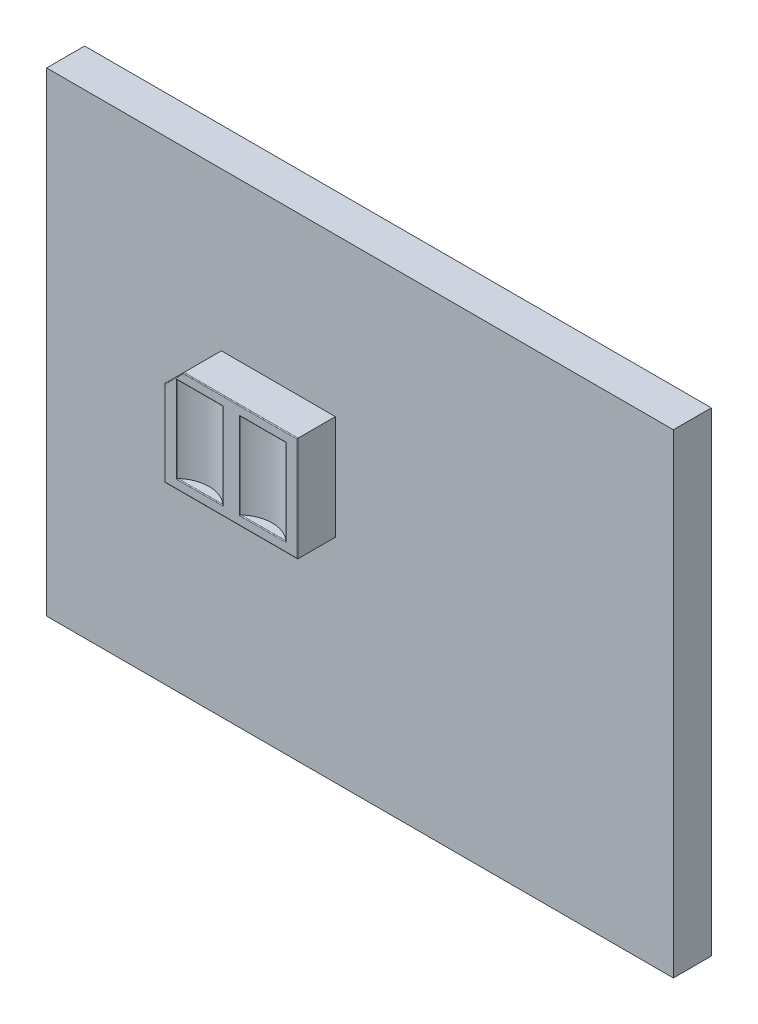
ISO-10303-21;
HEADER;
FILE_DESCRIPTION(('STEP AP214'),'2;1');
FILE_NAME('part.step','',(''),(''),'','','');
FILE_SCHEMA(('AUTOMOTIVE_DESIGN { 1 0 10303 214 1 1 1 1 }'));
ENDSEC;
DATA;
#1=APPLICATION_CONTEXT('core data for automotive mechanical design processes');
#2=APPLICATION_PROTOCOL_DEFINITION('international standard','automotive_design',2000,#1);
#3=PRODUCT_CONTEXT('',#1,'mechanical');
#4=PRODUCT('Part','Part','',(#3));
#5=PRODUCT_RELATED_PRODUCT_CATEGORY('part','',(#4));
#6=PRODUCT_DEFINITION_FORMATION('','',#4);
#7=PRODUCT_DEFINITION_CONTEXT('part definition',#1,'design');
#8=PRODUCT_DEFINITION('design','',#6,#7);
#9=PRODUCT_DEFINITION_SHAPE('','',#8);
#10=(LENGTH_UNIT() NAMED_UNIT(*) SI_UNIT(.MILLI.,.METRE.));
#11=(NAMED_UNIT(*) PLANE_ANGLE_UNIT() SI_UNIT($,.RADIAN.));
#12=(NAMED_UNIT(*) SI_UNIT($,.STERADIAN.) SOLID_ANGLE_UNIT());
#13=UNCERTAINTY_MEASURE_WITH_UNIT(LENGTH_MEASURE(1.E-05),#10,'distance_accuracy_value','');
#14=(GEOMETRIC_REPRESENTATION_CONTEXT(3) GLOBAL_UNCERTAINTY_ASSIGNED_CONTEXT((#13)) GLOBAL_UNIT_ASSIGNED_CONTEXT((#10,
#11,#12)) REPRESENTATION_CONTEXT('',''));
#15=CARTESIAN_POINT('',(0.,0.,0.));
#16=DIRECTION('',(0.,0.,1.));
#17=DIRECTION('',(1.,0.,0.));
#18=AXIS2_PLACEMENT_3D('',#15,#16,#17);
#19=CARTESIAN_POINT('',(-0.65,2.1,2.));
#20=DIRECTION('',(0.,0.,1.));
#21=DIRECTION('',(1.,0.,0.));
#22=AXIS2_PLACEMENT_3D('',#19,#20,#21);
#23=PLANE('',#22);
#24=DIRECTION('',(0.,1.,0.));
#25=VECTOR('',#24,1.);
#26=CARTESIAN_POINT('',(-2.59942700448033,-0.4,2.));
#27=LINE('',#26,#25);
#28=CARTESIAN_POINT('',(-2.59942700448033,1.87,2.));
#29=VERTEX_POINT('',#28);
#30=CARTESIAN_POINT('',(-2.59942700448033,-0.42,2.));
#31=VERTEX_POINT('',#30);
#32=EDGE_CURVE('E281',#29,#31,#27,.F.);
#33=ORIENTED_EDGE('',*,*,#32,.T.);
#34=DIRECTION('',(-1.,0.,0.));
#35=VECTOR('',#34,1.);
#36=CARTESIAN_POINT('',(-3.82761374775193,-0.42,2.));
#37=LINE('',#36,#35);
#38=CARTESIAN_POINT('',(-3.8355895614232,-0.42,2.));
#39=VERTEX_POINT('',#38);
#40=EDGE_CURVE('E283',#31,#39,#37,.T.);
#41=ORIENTED_EDGE('',*,*,#40,.T.);
#42=DIRECTION('',(0.,1.,0.));
#43=VECTOR('',#42,1.);
#44=CARTESIAN_POINT('',(-3.8355895614232,1.85,2.));
#45=LINE('',#44,#43);
#46=CARTESIAN_POINT('',(-3.8355895614232,1.87,2.));
#47=VERTEX_POINT('',#46);
#48=EDGE_CURVE('E277',#39,#47,#45,.T.);
#49=ORIENTED_EDGE('',*,*,#48,.T.);
#50=DIRECTION('',(-1.,0.,0.));
#51=VECTOR('',#50,1.);
#52=CARTESIAN_POINT('',(-0.65,1.87,2.));
#53=LINE('',#52,#51);
#54=EDGE_CURVE('E279',#47,#29,#53,.F.);
#55=ORIENTED_EDGE('',*,*,#54,.T.);
#56=EDGE_LOOP('',(#33,#41,#49,#55));
#57=FACE_BOUND('',#56,.T.);
#58=DIRECTION('',(0.,-1.,0.));
#59=VECTOR('',#58,1.);
#60=CARTESIAN_POINT('',(-4.13,-0.650000000000001,2.));
#61=LINE('',#60,#59);
#62=CARTESIAN_POINT('',(-4.13,1.59171572875254,2.));
#63=VERTEX_POINT('',#62);
#64=CARTESIAN_POINT('',(-4.13,-0.630000000000001,2.));
#65=VERTEX_POINT('',#64);
#66=EDGE_CURVE('E272',#63,#65,#61,.T.);
#67=ORIENTED_EDGE('',*,*,#66,.T.);
#68=DIRECTION('',(1.,0.,0.));
#69=VECTOR('',#68,1.);
#70=CARTESIAN_POINT('',(-0.65,-0.63,2.));
#71=LINE('',#70,#69);
#72=CARTESIAN_POINT('',(-0.67,-0.63,2.));
#73=VERTEX_POINT('',#72);
#74=EDGE_CURVE('E274',#65,#73,#71,.T.);
#75=ORIENTED_EDGE('',*,*,#74,.T.);
#76=DIRECTION('',(0.,1.,0.));
#77=VECTOR('',#76,1.);
#78=CARTESIAN_POINT('',(-0.67,2.1,2.));
#79=LINE('',#78,#77);
#80=CARTESIAN_POINT('',(-0.67,2.08,2.));
#81=VERTEX_POINT('',#80);
#82=EDGE_CURVE('E266',#73,#81,#79,.T.);
#83=ORIENTED_EDGE('',*,*,#82,.T.);
#84=DIRECTION('',(-1.,0.,0.));
#85=VECTOR('',#84,1.);
#86=CARTESIAN_POINT('',(-3.65,2.08,2.));
#87=LINE('',#86,#85);
#88=CARTESIAN_POINT('',(-3.64171572875254,2.08,2.));
#89=VERTEX_POINT('',#88);
#90=EDGE_CURVE('E268',#81,#89,#87,.T.);
#91=ORIENTED_EDGE('',*,*,#90,.T.);
#92=DIRECTION('',(-0.707106781186548,-0.707106781186548,0.));
#93=VECTOR('',#92,1.);
#94=CARTESIAN_POINT('',(-4.13585786437627,1.58585786437627,2.));
#95=LINE('',#94,#93);
#96=EDGE_CURVE('E270',#89,#63,#95,.T.);
#97=ORIENTED_EDGE('',*,*,#96,.T.);
#98=EDGE_LOOP('',(#67,#75,#83,#91,#97));
#99=FACE_BOUND('',#98,.T.);
#100=DIRECTION('',(-1.,0.,0.));
#101=VECTOR('',#100,1.);
#102=CARTESIAN_POINT('',(-0.65,-0.42,2.));
#103=LINE('',#102,#101);
#104=CARTESIAN_POINT('',(-0.940013759684475,-0.42,2.));
#105=VERTEX_POINT('',#104);
#106=CARTESIAN_POINT('',(-2.17617631662735,-0.42,2.));
#107=VERTEX_POINT('',#106);
#108=EDGE_CURVE('E261',#105,#107,#103,.T.);
#109=ORIENTED_EDGE('',*,*,#108,.T.);
#110=DIRECTION('',(0.,1.,0.));
#111=VECTOR('',#110,1.);
#112=CARTESIAN_POINT('',(-2.17617631662735,1.85,2.));
#113=LINE('',#112,#111);
#114=CARTESIAN_POINT('',(-2.17617631662735,1.87,2.));
#115=VERTEX_POINT('',#114);
#116=EDGE_CURVE('E263',#107,#115,#113,.T.);
#117=ORIENTED_EDGE('',*,*,#116,.T.);
#118=DIRECTION('',(-1.,0.,0.));
#119=VECTOR('',#118,1.);
#120=CARTESIAN_POINT('',(-0.947989573355746,1.87,2.));
#121=LINE('',#120,#119);
#122=CARTESIAN_POINT('',(-0.940013759684475,1.87,2.));
#123=VERTEX_POINT('',#122);
#124=EDGE_CURVE('E257',#115,#123,#121,.F.);
#125=ORIENTED_EDGE('',*,*,#124,.T.);
#126=DIRECTION('',(0.,1.,0.));
#127=VECTOR('',#126,1.);
#128=CARTESIAN_POINT('',(-0.940013759684475,-0.4,2.));
#129=LINE('',#128,#127);
#130=EDGE_CURVE('E259',#123,#105,#129,.F.);
#131=ORIENTED_EDGE('',*,*,#130,.T.);
#132=EDGE_LOOP('',(#109,#117,#125,#131));
#133=FACE_BOUND('',#132,.T.);
#134=ADVANCED_FACE('F33',(#57,#99,#133),#23,.T.);
#135=CARTESIAN_POINT('',(-8.25,-6.25,1.));
#136=DIRECTION('',(0.,0.,1.));
#137=DIRECTION('',(1.,0.,0.));
#138=AXIS2_PLACEMENT_3D('',#135,#136,#137);
#139=PLANE('',#138);
#140=DIRECTION('',(0.,-1.,0.));
#141=VECTOR('',#140,1.);
#142=CARTESIAN_POINT('',(-8.25,6.25,1.));
#143=LINE('',#142,#141);
#144=CARTESIAN_POINT('',(-8.25,6.25,1.));
#145=VERTEX_POINT('',#144);
#146=CARTESIAN_POINT('',(-8.25,-6.25,1.));
#147=VERTEX_POINT('',#146);
#148=EDGE_CURVE('E236',#145,#147,#143,.T.);
#149=ORIENTED_EDGE('',*,*,#148,.T.);
#150=DIRECTION('',(1.,0.,0.));
#151=VECTOR('',#150,1.);
#152=CARTESIAN_POINT('',(-8.25,-6.25,1.));
#153=LINE('',#152,#151);
#154=CARTESIAN_POINT('',(8.25,-6.25,1.));
#155=VERTEX_POINT('',#154);
#156=EDGE_CURVE('E239',#147,#155,#153,.T.);
#157=ORIENTED_EDGE('',*,*,#156,.T.);
#158=DIRECTION('',(0.,1.,0.));
#159=VECTOR('',#158,1.);
#160=CARTESIAN_POINT('',(8.25,6.25,1.));
#161=LINE('',#160,#159);
#162=CARTESIAN_POINT('',(8.25,6.25,1.));
#163=VERTEX_POINT('',#162);
#164=EDGE_CURVE('E241',#155,#163,#161,.T.);
#165=ORIENTED_EDGE('',*,*,#164,.T.);
#166=DIRECTION('',(-1.,0.,0.));
#167=VECTOR('',#166,1.);
#168=CARTESIAN_POINT('',(-8.25,6.25,1.));
#169=LINE('',#168,#167);
#170=EDGE_CURVE('E243',#163,#145,#169,.T.);
#171=ORIENTED_EDGE('',*,*,#170,.T.);
#172=EDGE_LOOP('',(#149,#157,#165,#171));
#173=FACE_BOUND('',#172,.T.);
#174=DIRECTION('',(1.,0.,0.));
#175=VECTOR('',#174,1.);
#176=CARTESIAN_POINT('',(-8.25,2.1,1.));
#177=LINE('',#176,#175);
#178=CARTESIAN_POINT('',(-3.65,2.1,1.));
#179=VERTEX_POINT('',#178);
#180=CARTESIAN_POINT('',(-0.65,2.1,1.));
#181=VERTEX_POINT('',#180);
#182=EDGE_CURVE('E221',#179,#181,#177,.T.);
#183=ORIENTED_EDGE('',*,*,#182,.T.);
#184=DIRECTION('',(0.,-1.,0.));
#185=VECTOR('',#184,1.);
#186=CARTESIAN_POINT('',(-0.65,-6.25,1.));
#187=LINE('',#186,#185);
#188=CARTESIAN_POINT('',(-0.65,-0.65,1.));
#189=VERTEX_POINT('',#188);
#190=EDGE_CURVE('E198',#181,#189,#187,.T.);
#191=ORIENTED_EDGE('',*,*,#190,.T.);
#192=DIRECTION('',(-1.,0.,0.));
#193=VECTOR('',#192,1.);
#194=CARTESIAN_POINT('',(-8.25,-0.650000000000001,1.));
#195=LINE('',#194,#193);
#196=CARTESIAN_POINT('',(-4.15,-0.650000000000001,1.));
#197=VERTEX_POINT('',#196);
#198=EDGE_CURVE('E209',#189,#197,#195,.T.);
#199=ORIENTED_EDGE('',*,*,#198,.T.);
#200=DIRECTION('',(0.,1.,0.));
#201=VECTOR('',#200,1.);
#202=CARTESIAN_POINT('',(-4.15,-6.25,1.));
#203=LINE('',#202,#201);
#204=CARTESIAN_POINT('',(-4.15,1.6,1.));
#205=VERTEX_POINT('',#204);
#206=EDGE_CURVE('E215',#197,#205,#203,.T.);
#207=ORIENTED_EDGE('',*,*,#206,.T.);
#208=DIRECTION('',(0.707106781186548,0.707106781186548,0.));
#209=VECTOR('',#208,1.);
#210=CARTESIAN_POINT('',(-10.125,-4.375,1.));
#211=LINE('',#210,#209);
#212=EDGE_CURVE('E227',#205,#179,#211,.T.);
#213=ORIENTED_EDGE('',*,*,#212,.T.);
#214=EDGE_LOOP('',(#183,#191,#199,#207,#213));
#215=FACE_BOUND('',#214,.T.);
#216=ADVANCED_FACE('F218',(#173,#215),#139,.T.);
#217=CARTESIAN_POINT('',(-8.25,6.25,1.));
#218=DIRECTION('',(1.,0.,0.));
#219=DIRECTION('',(0.,0.,-1.));
#220=AXIS2_PLACEMENT_3D('',#217,#218,#219);
#221=PLANE('',#220);
#222=DIRECTION('',(0.,-1.,0.));
#223=VECTOR('',#222,1.);
#224=CARTESIAN_POINT('',(-8.25,6.25,0.));
#225=LINE('',#224,#223);
#226=CARTESIAN_POINT('',(-8.25,6.25,0.));
#227=VERTEX_POINT('',#226);
#228=CARTESIAN_POINT('',(-8.25,-6.25,0.));
#229=VERTEX_POINT('',#228);
#230=EDGE_CURVE('E222',#227,#229,#225,.T.);
#231=ORIENTED_EDGE('',*,*,#230,.T.);
#232=DIRECTION('',(0.,0.,-1.));
#233=VECTOR('',#232,1.);
#234=CARTESIAN_POINT('',(-8.25,-6.25,1.));
#235=LINE('',#234,#233);
#236=EDGE_CURVE('E254',#147,#229,#235,.T.);
#237=ORIENTED_EDGE('',*,*,#236,.F.);
#238=ORIENTED_EDGE('',*,*,#148,.F.);
#239=DIRECTION('',(0.,0.,-1.));
#240=VECTOR('',#239,1.);
#241=CARTESIAN_POINT('',(-8.25,6.25,1.));
#242=LINE('',#241,#240);
#243=EDGE_CURVE('E245',#145,#227,#242,.T.);
#244=ORIENTED_EDGE('',*,*,#243,.T.);
#245=EDGE_LOOP('',(#231,#237,#238,#244));
#246=FACE_BOUND('',#245,.T.);
#247=ADVANCED_FACE('F35',(#246),#221,.F.);
#248=CARTESIAN_POINT('',(-8.25,-6.25,1.));
#249=DIRECTION('',(0.,1.,0.));
#250=DIRECTION('',(0.,0.,1.));
#251=AXIS2_PLACEMENT_3D('',#248,#249,#250);
#252=PLANE('',#251);
#253=DIRECTION('',(1.,0.,0.));
#254=VECTOR('',#253,1.);
#255=CARTESIAN_POINT('',(-8.25,-6.25,0.));
#256=LINE('',#255,#254);
#257=CARTESIAN_POINT('',(8.25,-6.25,0.));
#258=VERTEX_POINT('',#257);
#259=EDGE_CURVE('E225',#229,#258,#256,.T.);
#260=ORIENTED_EDGE('',*,*,#259,.T.);
#261=DIRECTION('',(0.,0.,-1.));
#262=VECTOR('',#261,1.);
#263=CARTESIAN_POINT('',(8.25,-6.25,1.));
#264=LINE('',#263,#262);
#265=EDGE_CURVE('E251',#155,#258,#264,.T.);
#266=ORIENTED_EDGE('',*,*,#265,.F.);
#267=ORIENTED_EDGE('',*,*,#156,.F.);
#268=ORIENTED_EDGE('',*,*,#236,.T.);
#269=EDGE_LOOP('',(#260,#266,#267,#268));
#270=FACE_BOUND('',#269,.T.);
#271=ADVANCED_FACE('F665',(#270),#252,.F.);
#272=CARTESIAN_POINT('',(8.25,6.25,1.));
#273=DIRECTION('',(-1.,0.,0.));
#274=DIRECTION('',(0.,0.,1.));
#275=AXIS2_PLACEMENT_3D('',#272,#273,#274);
#276=PLANE('',#275);
#277=DIRECTION('',(0.,1.,0.));
#278=VECTOR('',#277,1.);
#279=CARTESIAN_POINT('',(8.25,6.25,0.));
#280=LINE('',#279,#278);
#281=CARTESIAN_POINT('',(8.25,6.25,0.));
#282=VERTEX_POINT('',#281);
#283=EDGE_CURVE('E232',#258,#282,#280,.T.);
#284=ORIENTED_EDGE('',*,*,#283,.T.);
#285=DIRECTION('',(0.,0.,-1.));
#286=VECTOR('',#285,1.);
#287=CARTESIAN_POINT('',(8.25,6.25,1.));
#288=LINE('',#287,#286);
#289=EDGE_CURVE('E248',#163,#282,#288,.T.);
#290=ORIENTED_EDGE('',*,*,#289,.F.);
#291=ORIENTED_EDGE('',*,*,#164,.F.);
#292=ORIENTED_EDGE('',*,*,#265,.T.);
#293=EDGE_LOOP('',(#284,#290,#291,#292));
#294=FACE_BOUND('',#293,.T.);
#295=ADVANCED_FACE('F655',(#294),#276,.F.);
#296=CARTESIAN_POINT('',(-8.25,6.25,1.));
#297=DIRECTION('',(0.,-1.,0.));
#298=DIRECTION('',(0.,0.,-1.));
#299=AXIS2_PLACEMENT_3D('',#296,#297,#298);
#300=PLANE('',#299);
#301=DIRECTION('',(-1.,0.,0.));
#302=VECTOR('',#301,1.);
#303=CARTESIAN_POINT('',(-8.25,6.25,0.));
#304=LINE('',#303,#302);
#305=EDGE_CURVE('E234',#282,#227,#304,.T.);
#306=ORIENTED_EDGE('',*,*,#305,.T.);
#307=ORIENTED_EDGE('',*,*,#243,.F.);
#308=ORIENTED_EDGE('',*,*,#170,.F.);
#309=ORIENTED_EDGE('',*,*,#289,.T.);
#310=EDGE_LOOP('',(#306,#307,#308,#309));
#311=FACE_BOUND('',#310,.T.);
#312=ADVANCED_FACE('F637',(#311),#300,.F.);
#313=CARTESIAN_POINT('',(-8.25,-6.25,0.));
#314=DIRECTION('',(0.,0.,1.));
#315=DIRECTION('',(1.,0.,0.));
#316=AXIS2_PLACEMENT_3D('',#313,#314,#315);
#317=PLANE('',#316);
#318=ORIENTED_EDGE('',*,*,#230,.F.);
#319=ORIENTED_EDGE('',*,*,#305,.F.);
#320=ORIENTED_EDGE('',*,*,#283,.F.);
#321=ORIENTED_EDGE('',*,*,#259,.F.);
#322=EDGE_LOOP('',(#318,#319,#320,#321));
#323=FACE_BOUND('',#322,.T.);
#324=ADVANCED_FACE('F621',(#323),#317,.F.);
#325=CARTESIAN_POINT('',(-0.65,2.1,2.));
#326=DIRECTION('',(-1.,0.,0.));
#327=DIRECTION('',(0.,0.,1.));
#328=AXIS2_PLACEMENT_3D('',#325,#326,#327);
#329=PLANE('',#328);
#330=DIRECTION('',(0.,0.,-1.));
#331=VECTOR('',#330,1.);
#332=CARTESIAN_POINT('',(-0.65,2.1,2.));
#333=LINE('',#332,#331);
#334=CARTESIAN_POINT('',(-0.65,2.1,1.98));
#335=VERTEX_POINT('',#334);
#336=EDGE_CURVE('E216',#335,#181,#333,.T.);
#337=ORIENTED_EDGE('',*,*,#336,.F.);
#338=DIRECTION('',(0.,1.,0.));
#339=VECTOR('',#338,1.);
#340=CARTESIAN_POINT('',(-0.65,-0.65,1.98));
#341=LINE('',#340,#339);
#342=CARTESIAN_POINT('',(-0.65,-0.65,1.98));
#343=VERTEX_POINT('',#342);
#344=EDGE_CURVE('E201',#335,#343,#341,.F.);
#345=ORIENTED_EDGE('',*,*,#344,.T.);
#346=DIRECTION('',(0.,0.,-1.));
#347=VECTOR('',#346,1.);
#348=CARTESIAN_POINT('',(-0.65,-0.65,2.));
#349=LINE('',#348,#347);
#350=EDGE_CURVE('E193',#343,#189,#349,.T.);
#351=ORIENTED_EDGE('',*,*,#350,.T.);
#352=ORIENTED_EDGE('',*,*,#190,.F.);
#353=EDGE_LOOP('',(#337,#345,#351,#352));
#354=FACE_BOUND('',#353,.T.);
#355=ADVANCED_FACE('F196',(#354),#329,.F.);
#356=CARTESIAN_POINT('',(-3.65,2.1,2.));
#357=DIRECTION('',(0.,-1.,0.));
#358=DIRECTION('',(0.,0.,-1.));
#359=AXIS2_PLACEMENT_3D('',#356,#357,#358);
#360=PLANE('',#359);
#361=DIRECTION('',(0.,0.,-1.));
#362=VECTOR('',#361,1.);
#363=CARTESIAN_POINT('',(-3.65,2.1,2.));
#364=LINE('',#363,#362);
#365=CARTESIAN_POINT('',(-3.65,2.1,1.98));
#366=VERTEX_POINT('',#365);
#367=EDGE_CURVE('E452',#366,#179,#364,.T.);
#368=ORIENTED_EDGE('',*,*,#367,.F.);
#369=DIRECTION('',(-1.,0.,0.));
#370=VECTOR('',#369,1.);
#371=CARTESIAN_POINT('',(-0.65,2.1,1.98));
#372=LINE('',#371,#370);
#373=EDGE_CURVE('E301',#366,#335,#372,.F.);
#374=ORIENTED_EDGE('',*,*,#373,.T.);
#375=ORIENTED_EDGE('',*,*,#336,.T.);
#376=ORIENTED_EDGE('',*,*,#182,.F.);
#377=EDGE_LOOP('',(#368,#374,#375,#376));
#378=FACE_BOUND('',#377,.T.);
#379=ADVANCED_FACE('F463',(#378),#360,.F.);
#380=CARTESIAN_POINT('',(-4.15,1.6,2.));
#381=DIRECTION('',(0.707106781186547,-0.707106781186547,0.));
#382=DIRECTION('',(0.707106781186548,0.707106781186548,0.));
#383=AXIS2_PLACEMENT_3D('',#380,#381,#382);
#384=PLANE('',#383);
#385=DIRECTION('',(0.,0.,-1.));
#386=VECTOR('',#385,1.);
#387=CARTESIAN_POINT('',(-4.15,1.6,2.));
#388=LINE('',#387,#386);
#389=CARTESIAN_POINT('',(-4.15,1.6,1.98));
#390=VERTEX_POINT('',#389);
#391=EDGE_CURVE('E450',#390,#205,#388,.T.);
#392=ORIENTED_EDGE('',*,*,#391,.F.);
#393=DIRECTION('',(-0.707106781186548,-0.707106781186548,0.));
#394=VECTOR('',#393,1.);
#395=CARTESIAN_POINT('',(-3.65,2.1,1.98));
#396=LINE('',#395,#394);
#397=EDGE_CURVE('E299',#390,#366,#396,.F.);
#398=ORIENTED_EDGE('',*,*,#397,.T.);
#399=ORIENTED_EDGE('',*,*,#367,.T.);
#400=ORIENTED_EDGE('',*,*,#212,.F.);
#401=EDGE_LOOP('',(#392,#398,#399,#400));
#402=FACE_BOUND('',#401,.T.);
#403=ADVANCED_FACE('F458',(#402),#384,.F.);
#404=CARTESIAN_POINT('',(-4.15,-0.650000000000001,2.));
#405=DIRECTION('',(1.,0.,0.));
#406=DIRECTION('',(0.,0.,-1.));
#407=AXIS2_PLACEMENT_3D('',#404,#405,#406);
#408=PLANE('',#407);
#409=DIRECTION('',(0.,0.,-1.));
#410=VECTOR('',#409,1.);
#411=CARTESIAN_POINT('',(-4.15,-0.650000000000001,2.));
#412=LINE('',#411,#410);
#413=CARTESIAN_POINT('',(-4.15,-0.650000000000001,1.98));
#414=VERTEX_POINT('',#413);
#415=EDGE_CURVE('E205',#414,#197,#412,.T.);
#416=ORIENTED_EDGE('',*,*,#415,.F.);
#417=DIRECTION('',(0.,-1.,0.));
#418=VECTOR('',#417,1.);
#419=CARTESIAN_POINT('',(-4.15,1.6,1.98));
#420=LINE('',#419,#418);
#421=EDGE_CURVE('E297',#414,#390,#420,.F.);
#422=ORIENTED_EDGE('',*,*,#421,.T.);
#423=ORIENTED_EDGE('',*,*,#391,.T.);
#424=ORIENTED_EDGE('',*,*,#206,.F.);
#425=EDGE_LOOP('',(#416,#422,#423,#424));
#426=FACE_BOUND('',#425,.T.);
#427=ADVANCED_FACE('F479',(#426),#408,.F.);
#428=CARTESIAN_POINT('',(-0.65,-0.65,2.));
#429=DIRECTION('',(0.,1.,0.));
#430=DIRECTION('',(-1.,0.,0.));
#431=AXIS2_PLACEMENT_3D('',#428,#429,#430);
#432=PLANE('',#431);
#433=ORIENTED_EDGE('',*,*,#350,.F.);
#434=DIRECTION('',(1.,0.,0.));
#435=VECTOR('',#434,1.);
#436=CARTESIAN_POINT('',(-4.15,-0.650000000000001,1.98));
#437=LINE('',#436,#435);
#438=EDGE_CURVE('E295',#343,#414,#437,.F.);
#439=ORIENTED_EDGE('',*,*,#438,.T.);
#440=ORIENTED_EDGE('',*,*,#415,.T.);
#441=ORIENTED_EDGE('',*,*,#198,.F.);
#442=EDGE_LOOP('',(#433,#439,#440,#441));
#443=FACE_BOUND('',#442,.T.);
#444=ADVANCED_FACE('F210',(#443),#432,.F.);
#445=CARTESIAN_POINT('',(-3.21750828295176,1.85,2.63752959298475));
#446=DIRECTION('',(0.,-1.,0.));
#447=DIRECTION('',(0.,0.,-1.));
#448=AXIS2_PLACEMENT_3D('',#445,#446,#447);
#449=CYLINDRICAL_SURFACE('',#448,0.882424308431226);
#450=CARTESIAN_POINT('',(-2.62901232335677,-0.4,1.98));
#451=CARTESIAN_POINT('',(-2.6272001316614,-0.400004634660675,1.981621199439));
#452=CARTESIAN_POINT('',(-2.62538571149282,-0.400198276106645,1.98325934375462));
#453=CARTESIAN_POINT('',(-2.62187863735291,-0.40099829366427,1.98645110285122));
#454=CARTESIAN_POINT('',(-2.62018395909179,-0.40159196531506,1.98800577418616));
#455=CARTESIAN_POINT('',(-2.61759664214169,-0.402885588597754,1.99039714079998));
#456=CARTESIAN_POINT('',(-2.61666159627895,-0.403440608762065,1.99126539401272));
#457=CARTESIAN_POINT('',(-2.6148428174497,-0.404730489495306,1.99296106021631));
#458=CARTESIAN_POINT('',(-2.61396033838843,-0.405468458520367,1.99378743358305));
#459=CARTESIAN_POINT('',(-2.61312524542647,-0.406301759053861,1.9945725150534));
#460=B_SPLINE_CURVE_WITH_KNOTS('',3,(#450,#451,#452,#453,#454,#455,#456,#457,#458,#459),
.UNSPECIFIED.,.F.,.F.,(4,2,2,2,4),(0.,0.00730858401600523,0.0143953594583399,0.0185579599262181,
0.0227968207252711),.UNSPECIFIED.);
#461=CARTESIAN_POINT('',(-2.62901232335677,-0.4,1.98));
#462=VERTEX_POINT('',#461);
#463=CARTESIAN_POINT('',(-2.61312524537869,-0.406301758875194,1.99457251509831));
#464=VERTEX_POINT('',#463);
#465=EDGE_CURVE('E318',#462,#464,#460,.T.);
#466=ORIENTED_EDGE('',*,*,#465,.T.);
#467=DIRECTION('',(0.,-1.,0.));
#468=VECTOR('',#467,1.);
#469=CARTESIAN_POINT('',(-2.61312524537869,1.85,1.99457251509831));
#470=LINE('',#469,#468);
#471=CARTESIAN_POINT('',(-2.61312524537869,1.85630175887519,1.99457251509831));
#472=VERTEX_POINT('',#471);
#473=EDGE_CURVE('E291',#464,#472,#470,.F.);
#474=ORIENTED_EDGE('',*,*,#473,.T.);
#475=CARTESIAN_POINT('',(-2.61312524537869,1.85630175887519,1.99457251509831));
#476=CARTESIAN_POINT('',(-2.61414134057494,1.85528984686767,1.99361714979618));
#477=CARTESIAN_POINT('',(-2.61522530800247,1.85441776198288,1.99260297294066));
#478=CARTESIAN_POINT('',(-2.61746513538666,1.85294195625868,1.99051869911703));
#479=CARTESIAN_POINT('',(-2.61861900017123,1.85233296977245,1.98945022993181));
#480=CARTESIAN_POINT('',(-2.62125844312157,1.85121416392089,1.98702000571836));
#481=CARTESIAN_POINT('',(-2.62275825517914,1.85076127383068,1.98564833132565));
#482=CARTESIAN_POINT('',(-2.62584154788424,1.85015153704388,1.98284822149197));
#483=CARTESIAN_POINT('',(-2.62742619272369,1.8500028705072,1.98141924599033));
#484=CARTESIAN_POINT('',(-2.62901232335594,1.84999999999728,1.98000000000036));
#485=B_SPLINE_CURVE_WITH_KNOTS('',3,(#475,#476,#477,#478,#479,#480,#481,#482,#483,#484),
.UNSPECIFIED.,.F.,.F.,(4,2,2,2,4),(0.,0.00514761137983454,0.0101867987244266,0.0164101130178888,
0.0227986750572116),.UNSPECIFIED.);
#486=CARTESIAN_POINT('',(-2.62901232335677,1.85,1.98));
#487=VERTEX_POINT('',#486);
#488=EDGE_CURVE('E357',#472,#487,#485,.T.);
#489=ORIENTED_EDGE('',*,*,#488,.T.);
#490=CARTESIAN_POINT('',(-3.21750828295176,1.85,2.63752959298475));
#491=DIRECTION('',(0.,-1.,0.));
#492=DIRECTION('',(0.,0.,-1.));
#493=AXIS2_PLACEMENT_3D('',#490,#491,#492);
#494=CIRCLE('',#493,0.882424308431226);
#495=CARTESIAN_POINT('',(-3.80600424254676,1.85,1.98));
#496=VERTEX_POINT('',#495);
#497=EDGE_CURVE('E206',#496,#487,#494,.T.);
#498=ORIENTED_EDGE('',*,*,#497,.F.);
#499=CARTESIAN_POINT('',(-3.80600424254666,1.85,1.97999999999991));
#500=CARTESIAN_POINT('',(-3.80781643424204,1.85000463466067,1.98162119943892));
#501=CARTESIAN_POINT('',(-3.80963085441062,1.85019827610663,1.98325934375454));
#502=CARTESIAN_POINT('',(-3.81313792855054,1.85099829366424,1.98645110285114));
#503=CARTESIAN_POINT('',(-3.81483260681166,1.85159196531503,1.98800577418608));
#504=CARTESIAN_POINT('',(-3.81741992376178,1.85288558859772,1.99039714079993));
#505=CARTESIAN_POINT('',(-3.81835496962453,1.85344060876203,1.99126539401268));
#506=CARTESIAN_POINT('',(-3.8201737484538,1.85473048949529,1.99296106021629));
#507=CARTESIAN_POINT('',(-3.82105622751509,1.85546845852036,1.99378743358304));
#508=CARTESIAN_POINT('',(-3.82189132047706,1.85630175905386,1.9945725150534));
#509=B_SPLINE_CURVE_WITH_KNOTS('',3,(#499,#500,#501,#502,#503,#504,#505,#506,#507,#508),
.UNSPECIFIED.,.F.,.F.,(4,2,2,2,4),(0.,0.00730858401601745,0.0143953594583633,0.0185579599262927,
0.0227968207253995),.UNSPECIFIED.);
#510=CARTESIAN_POINT('',(-3.82189132052484,1.85630175887519,1.99457251509831));
#511=VERTEX_POINT('',#510);
#512=EDGE_CURVE('E352',#496,#511,#509,.T.);
#513=ORIENTED_EDGE('',*,*,#512,.T.);
#514=DIRECTION('',(0.,-1.,0.));
#515=VECTOR('',#514,1.);
#516=CARTESIAN_POINT('',(-3.82189132052484,1.85,1.99457251509831));
#517=LINE('',#516,#515);
#518=CARTESIAN_POINT('',(-3.82189132052484,-0.406301758875194,1.99457251509831));
#519=VERTEX_POINT('',#518);
#520=EDGE_CURVE('E289',#511,#519,#517,.T.);
#521=ORIENTED_EDGE('',*,*,#520,.T.);
#522=CARTESIAN_POINT('',(-3.82189132052484,-0.406301758875194,1.99457251509831));
#523=CARTESIAN_POINT('',(-3.82087522532859,-0.405289846867672,1.99361714979618));
#524=CARTESIAN_POINT('',(-3.81979125790106,-0.404417761982883,1.99260297294066));
#525=CARTESIAN_POINT('',(-3.81755143051686,-0.402941956258676,1.99051869911703));
#526=CARTESIAN_POINT('',(-3.8163975657323,-0.402332969772448,1.98945022993181));
#527=CARTESIAN_POINT('',(-3.81375812278196,-0.401214163920892,1.98702000571836));
#528=CARTESIAN_POINT('',(-3.81225831072439,-0.400761273830685,1.98564833132565));
#529=CARTESIAN_POINT('',(-3.80917501801928,-0.400151537043876,1.98284822149197));
#530=CARTESIAN_POINT('',(-3.80759037317983,-0.4000028705072,1.98141924599032));
#531=CARTESIAN_POINT('',(-3.80600424254758,-0.399999999997281,1.98000000000035));
#532=B_SPLINE_CURVE_WITH_KNOTS('',3,(#522,#523,#524,#525,#526,#527,#528,#529,#530,#531),
.UNSPECIFIED.,.F.,.F.,(4,2,2,2,4),(0.,0.00514761137983448,0.0101867987244265,0.0164101130178927,
0.0227986750572186),.UNSPECIFIED.);
#533=CARTESIAN_POINT('',(-3.80600424254676,-0.4,1.98));
#534=VERTEX_POINT('',#533);
#535=EDGE_CURVE('E311',#519,#534,#532,.T.);
#536=ORIENTED_EDGE('',*,*,#535,.T.);
#537=CARTESIAN_POINT('',(-3.21750828295176,-0.4,2.63752959298475));
#538=DIRECTION('',(0.,-1.,0.));
#539=DIRECTION('',(0.,0.,-1.));
#540=AXIS2_PLACEMENT_3D('',#537,#538,#539);
#541=CIRCLE('',#540,0.882424308431226);
#542=EDGE_CURVE('E444',#534,#462,#541,.T.);
#543=ORIENTED_EDGE('',*,*,#542,.T.);
#544=EDGE_LOOP('',(#466,#474,#489,#498,#513,#521,#536,#543));
#545=FACE_BOUND('',#544,.T.);
#546=ADVANCED_FACE('F323',(#545),#449,.F.);
#547=CARTESIAN_POINT('',(-3.21750828295176,1.85,2.63752959298475));
#548=DIRECTION('',(0.,-1.,0.));
#549=DIRECTION('',(0.,0.,-1.));
#550=AXIS2_PLACEMENT_3D('',#547,#548,#549);
#551=PLANE('',#550);
#552=ORIENTED_EDGE('',*,*,#497,.T.);
#553=DIRECTION('',(-1.,0.,0.));
#554=VECTOR('',#553,1.);
#555=CARTESIAN_POINT('',(-3.21750828295176,1.85,1.98));
#556=LINE('',#555,#554);
#557=EDGE_CURVE('E293',#487,#496,#556,.T.);
#558=ORIENTED_EDGE('',*,*,#557,.T.);
#559=EDGE_LOOP('',(#552,#558));
#560=FACE_BOUND('',#559,.T.);
#561=ADVANCED_FACE('F563',(#560),#551,.T.);
#562=CARTESIAN_POINT('',(-3.21750828295176,-0.4,2.63752959298475));
#563=DIRECTION('',(0.,-1.,0.));
#564=DIRECTION('',(0.,0.,-1.));
#565=AXIS2_PLACEMENT_3D('',#562,#563,#564);
#566=PLANE('',#565);
#567=ORIENTED_EDGE('',*,*,#542,.F.);
#568=DIRECTION('',(-1.,0.,0.));
#569=VECTOR('',#568,1.);
#570=CARTESIAN_POINT('',(-2.6074028181516,-0.4,1.98));
#571=LINE('',#570,#569);
#572=EDGE_CURVE('E286',#534,#462,#571,.F.);
#573=ORIENTED_EDGE('',*,*,#572,.T.);
#574=EDGE_LOOP('',(#567,#573));
#575=FACE_BOUND('',#574,.T.);
#576=ADVANCED_FACE('F505',(#575),#566,.F.);
#577=CARTESIAN_POINT('',(-1.55809503815591,1.85,2.63752959298475));
#578=DIRECTION('',(0.,-1.,0.));
#579=DIRECTION('',(0.,0.,-1.));
#580=AXIS2_PLACEMENT_3D('',#577,#578,#579);
#581=CYLINDRICAL_SURFACE('',#580,0.882424308431226);
#582=CARTESIAN_POINT('',(-1.55809503815591,1.85,2.63752959298475));
#583=DIRECTION('',(0.,-1.,0.));
#584=DIRECTION('',(0.,0.,1.));
#585=AXIS2_PLACEMENT_3D('',#582,#583,#584);
#586=CIRCLE('',#585,0.882424308431226);
#587=CARTESIAN_POINT('',(-2.14659099775091,1.85,1.98));
#588=VERTEX_POINT('',#587);
#589=CARTESIAN_POINT('',(-0.969599078560915,1.85,1.98));
#590=VERTEX_POINT('',#589);
#591=EDGE_CURVE('E441',#588,#590,#586,.T.);
#592=ORIENTED_EDGE('',*,*,#591,.F.);
#593=CARTESIAN_POINT('',(-2.14659099775081,1.85,1.97999999999991));
#594=CARTESIAN_POINT('',(-2.14840318944619,1.85000463466067,1.98162119943892));
#595=CARTESIAN_POINT('',(-2.15021760961477,1.85019827610663,1.98325934375454));
#596=CARTESIAN_POINT('',(-2.15372468375469,1.85099829366424,1.98645110285114));
#597=CARTESIAN_POINT('',(-2.1554193620158,1.85159196531503,1.98800577418609));
#598=CARTESIAN_POINT('',(-2.15800667896593,1.85288558859772,1.99039714079993));
#599=CARTESIAN_POINT('',(-2.15894172482868,1.85344060876203,1.99126539401268));
#600=CARTESIAN_POINT('',(-2.16076050365795,1.85473048949529,1.99296106021629));
#601=CARTESIAN_POINT('',(-2.16164298271923,1.85546845852036,1.99378743358304));
#602=CARTESIAN_POINT('',(-2.16247807568121,1.85630175905386,1.9945725150534));
#603=B_SPLINE_CURVE_WITH_KNOTS('',3,(#593,#594,#595,#596,#597,#598,#599,#600,#601,#602),
.UNSPECIFIED.,.F.,.F.,(4,2,2,2,4),(0.,0.0073085840160175,0.0143953594583634,0.0185579599262915,
0.022796820725398),.UNSPECIFIED.);
#604=CARTESIAN_POINT('',(-2.16247807572899,1.85630175887519,1.99457251509831));
#605=VERTEX_POINT('',#604);
#606=EDGE_CURVE('E46',#588,#605,#603,.T.);
#607=ORIENTED_EDGE('',*,*,#606,.T.);
#608=DIRECTION('',(0.,-1.,0.));
#609=VECTOR('',#608,1.);
#610=CARTESIAN_POINT('',(-2.16247807572899,1.85,1.99457251509831));
#611=LINE('',#610,#609);
#612=CARTESIAN_POINT('',(-2.16247807572899,-0.406301758875193,1.99457251509831));
#613=VERTEX_POINT('',#612);
#614=EDGE_CURVE('E305',#605,#613,#611,.T.);
#615=ORIENTED_EDGE('',*,*,#614,.T.);
#616=CARTESIAN_POINT('',(-2.16247807572899,-0.406301758875193,1.99457251509831));
#617=CARTESIAN_POINT('',(-2.16146198053274,-0.405289846867671,1.99361714979618));
#618=CARTESIAN_POINT('',(-2.16037801310521,-0.404417761982883,1.99260297294066));
#619=CARTESIAN_POINT('',(-2.15813818572101,-0.402941956258676,1.99051869911703));
#620=CARTESIAN_POINT('',(-2.15698432093644,-0.402332969772448,1.98945022993181));
#621=CARTESIAN_POINT('',(-2.15434487798611,-0.401214163920892,1.98702000571836));
#622=CARTESIAN_POINT('',(-2.15284506592854,-0.400761273830685,1.98564833132565));
#623=CARTESIAN_POINT('',(-2.14976177322343,-0.400151537043876,1.98284822149197));
#624=CARTESIAN_POINT('',(-2.14817712838398,-0.4000028705072,1.98141924599032));
#625=CARTESIAN_POINT('',(-2.14659099775173,-0.399999999997281,1.98000000000035));
#626=B_SPLINE_CURVE_WITH_KNOTS('',3,(#616,#617,#618,#619,#620,#621,#622,#623,#624,#625),
.UNSPECIFIED.,.F.,.F.,(4,2,2,2,4),(0.,0.00514761137983409,0.0101867987244264,0.016410113017893,
0.022798675057217),.UNSPECIFIED.);
#627=CARTESIAN_POINT('',(-2.14659099775091,-0.4,1.98));
#628=VERTEX_POINT('',#627);
#629=EDGE_CURVE('E362',#613,#628,#626,.T.);
#630=ORIENTED_EDGE('',*,*,#629,.T.);
#631=CARTESIAN_POINT('',(-1.55809503815591,-0.4,2.63752959298475));
#632=DIRECTION('',(0.,-1.,0.));
#633=DIRECTION('',(0.,0.,1.));
#634=AXIS2_PLACEMENT_3D('',#631,#632,#633);
#635=CIRCLE('',#634,0.882424308431226);
#636=CARTESIAN_POINT('',(-0.969599078560915,-0.4,1.98));
#637=VERTEX_POINT('',#636);
#638=EDGE_CURVE('E401',#628,#637,#635,.T.);
#639=ORIENTED_EDGE('',*,*,#638,.T.);
#640=CARTESIAN_POINT('',(-0.969599078560914,-0.4,1.98));
#641=CARTESIAN_POINT('',(-0.967786886865544,-0.400004634660675,1.981621199439));
#642=CARTESIAN_POINT('',(-0.965972466696964,-0.400198276106645,1.98325934375462));
#643=CARTESIAN_POINT('',(-0.962465392557053,-0.40099829366427,1.98645110285122));
#644=CARTESIAN_POINT('',(-0.960770714295942,-0.40159196531506,1.98800577418616));
#645=CARTESIAN_POINT('',(-0.958183397345835,-0.402885588597755,1.99039714079998));
#646=CARTESIAN_POINT('',(-0.957248351483098,-0.403440608762065,1.99126539401272));
#647=CARTESIAN_POINT('',(-0.95542957265385,-0.404730489495306,1.99296106021631));
#648=CARTESIAN_POINT('',(-0.954547093592578,-0.405468458520367,1.99378743358305));
#649=CARTESIAN_POINT('',(-0.953712000630615,-0.406301759053861,1.9945725150534));
#650=B_SPLINE_CURVE_WITH_KNOTS('',3,(#640,#641,#642,#643,#644,#645,#646,#647,#648,#649),
.UNSPECIFIED.,.F.,.F.,(4,2,2,2,4),(0.,0.00730858401600573,0.0143953594583401,0.0185579599262176,
0.0227968207252712),.UNSPECIFIED.);
#651=CARTESIAN_POINT('',(-0.953712000582837,-0.406301758875194,1.99457251509831));
#652=VERTEX_POINT('',#651);
#653=EDGE_CURVE('E368',#637,#652,#650,.T.);
#654=ORIENTED_EDGE('',*,*,#653,.T.);
#655=DIRECTION('',(0.,-1.,0.));
#656=VECTOR('',#655,1.);
#657=CARTESIAN_POINT('',(-0.953712000582837,1.85,1.99457251509831));
#658=LINE('',#657,#656);
#659=CARTESIAN_POINT('',(-0.953712000582837,1.85630175887519,1.99457251509831));
#660=VERTEX_POINT('',#659);
#661=EDGE_CURVE('E52',#652,#660,#658,.F.);
#662=ORIENTED_EDGE('',*,*,#661,.T.);
#663=CARTESIAN_POINT('',(-0.953712000582837,1.85630175887519,1.99457251509831));
#664=CARTESIAN_POINT('',(-0.954728095779083,1.85528984686767,1.99361714979618));
#665=CARTESIAN_POINT('',(-0.955812063206615,1.85441776198288,1.99260297294066));
#666=CARTESIAN_POINT('',(-0.958051890590812,1.85294195625868,1.99051869911703));
#667=CARTESIAN_POINT('',(-0.959205755375378,1.85233296977245,1.98945022993181));
#668=CARTESIAN_POINT('',(-0.961845198325713,1.85121416392089,1.98702000571836));
#669=CARTESIAN_POINT('',(-0.963345010383286,1.85076127383068,1.98564833132565));
#670=CARTESIAN_POINT('',(-0.966428303088391,1.85015153704388,1.98284822149197));
#671=CARTESIAN_POINT('',(-0.968012947927843,1.8500028705072,1.98141924599033));
#672=CARTESIAN_POINT('',(-0.96959907856009,1.84999999999728,1.98000000000036));
#673=B_SPLINE_CURVE_WITH_KNOTS('',3,(#663,#664,#665,#666,#667,#668,#669,#670,#671,#672),
.UNSPECIFIED.,.F.,.F.,(4,2,2,2,4),(0.,0.0051476113798344,0.0101867987244265,0.0164101130178895,
0.0227986750572123),.UNSPECIFIED.);
#674=EDGE_CURVE('E11',#660,#590,#673,.T.);
#675=ORIENTED_EDGE('',*,*,#674,.T.);
#676=EDGE_LOOP('',(#592,#607,#615,#630,#639,#654,#662,#675));
#677=FACE_BOUND('',#676,.T.);
#678=ADVANCED_FACE('F372',(#677),#581,.F.);
#679=CARTESIAN_POINT('',(-1.55809503815591,1.85,2.63752959298475));
#680=DIRECTION('',(0.,1.,0.));
#681=DIRECTION('',(0.,0.,1.));
#682=AXIS2_PLACEMENT_3D('',#679,#680,#681);
#683=PLANE('',#682);
#684=ORIENTED_EDGE('',*,*,#591,.T.);
#685=DIRECTION('',(-1.,0.,0.));
#686=VECTOR('',#685,1.);
#687=CARTESIAN_POINT('',(-2.16820050295608,1.85,1.98));
#688=LINE('',#687,#686);
#689=EDGE_CURVE('E309',#590,#588,#688,.T.);
#690=ORIENTED_EDGE('',*,*,#689,.T.);
#691=EDGE_LOOP('',(#684,#690));
#692=FACE_BOUND('',#691,.T.);
#693=ADVANCED_FACE('F497',(#692),#683,.F.);
#694=CARTESIAN_POINT('',(-1.55809503815591,-0.4,2.63752959298475));
#695=DIRECTION('',(0.,1.,0.));
#696=DIRECTION('',(0.,0.,1.));
#697=AXIS2_PLACEMENT_3D('',#694,#695,#696);
#698=PLANE('',#697);
#699=ORIENTED_EDGE('',*,*,#638,.F.);
#700=DIRECTION('',(-1.,0.,0.));
#701=VECTOR('',#700,1.);
#702=CARTESIAN_POINT('',(-1.55809503815591,-0.4,1.98));
#703=LINE('',#702,#701);
#704=EDGE_CURVE('E307',#628,#637,#703,.F.);
#705=ORIENTED_EDGE('',*,*,#704,.T.);
#706=EDGE_LOOP('',(#699,#705));
#707=FACE_BOUND('',#706,.T.);
#708=ADVANCED_FACE('F348',(#707),#698,.T.);
#709=CARTESIAN_POINT('',(-3.21750828295176,1.87,1.98));
#710=DIRECTION('',(-1.,0.,0.));
#711=DIRECTION('',(0.,0.,1.));
#712=AXIS2_PLACEMENT_3D('',#709,#710,#711);
#713=CYLINDRICAL_SURFACE('',#712,0.02);
#714=ORIENTED_EDGE('',*,*,#557,.F.);
#715=ORIENTED_EDGE('',*,*,#488,.F.);
#716=CARTESIAN_POINT('',(-2.59942700448033,1.87,1.98));
#717=DIRECTION('',(0.707106781186547,-0.707106781186547,0.));
#718=DIRECTION('',(-0.707106781186547,-0.707106781186547,0.));
#719=AXIS2_PLACEMENT_3D('',#716,#717,#718);
#720=ELLIPSE('',#719,0.0282842712474619,0.02);
#721=EDGE_CURVE('E437',#29,#472,#720,.T.);
#722=ORIENTED_EDGE('',*,*,#721,.F.);
#723=ORIENTED_EDGE('',*,*,#54,.F.);
#724=CARTESIAN_POINT('',(-3.8355895614232,1.87,1.98));
#725=DIRECTION('',(-0.707106781186547,-0.707106781186547,0.));
#726=DIRECTION('',(-0.707106781186547,0.707106781186547,0.));
#727=AXIS2_PLACEMENT_3D('',#724,#725,#726);
#728=ELLIPSE('',#727,0.0282842712474619,0.02);
#729=EDGE_CURVE('E434',#511,#47,#728,.T.);
#730=ORIENTED_EDGE('',*,*,#729,.F.);
#731=ORIENTED_EDGE('',*,*,#512,.F.);
#732=EDGE_LOOP('',(#714,#715,#722,#723,#730,#731));
#733=FACE_BOUND('',#732,.T.);
#734=ADVANCED_FACE('F343',(#733),#713,.T.);
#735=CARTESIAN_POINT('',(-2.59942700448033,1.85,1.98));
#736=DIRECTION('',(0.,-1.,0.));
#737=DIRECTION('',(0.,0.,-1.));
#738=AXIS2_PLACEMENT_3D('',#735,#736,#737);
#739=CYLINDRICAL_SURFACE('',#738,0.02);
#740=ORIENTED_EDGE('',*,*,#473,.F.);
#741=CARTESIAN_POINT('',(-2.59942700448033,-0.42,1.98));
#742=DIRECTION('',(0.707106781186547,0.707106781186547,0.));
#743=DIRECTION('',(0.707106781186547,-0.707106781186547,0.));
#744=AXIS2_PLACEMENT_3D('',#741,#742,#743);
#745=ELLIPSE('',#744,0.0282842712474619,0.02);
#746=EDGE_CURVE('E431',#31,#464,#745,.F.);
#747=ORIENTED_EDGE('',*,*,#746,.F.);
#748=ORIENTED_EDGE('',*,*,#32,.F.);
#749=ORIENTED_EDGE('',*,*,#721,.T.);
#750=EDGE_LOOP('',(#740,#747,#748,#749));
#751=FACE_BOUND('',#750,.T.);
#752=ADVANCED_FACE('F339',(#751),#739,.T.);
#753=CARTESIAN_POINT('',(-3.8355895614232,1.85,1.98));
#754=DIRECTION('',(0.,-1.,0.));
#755=DIRECTION('',(0.,0.,-1.));
#756=AXIS2_PLACEMENT_3D('',#753,#754,#755);
#757=CYLINDRICAL_SURFACE('',#756,0.02);
#758=ORIENTED_EDGE('',*,*,#729,.T.);
#759=ORIENTED_EDGE('',*,*,#48,.F.);
#760=CARTESIAN_POINT('',(-3.8355895614232,-0.42,1.98));
#761=DIRECTION('',(0.707106781186547,-0.707106781186547,0.));
#762=DIRECTION('',(0.707106781186547,0.707106781186547,0.));
#763=AXIS2_PLACEMENT_3D('',#760,#761,#762);
#764=ELLIPSE('',#763,0.0282842712474619,0.02);
#765=EDGE_CURVE('E429',#519,#39,#764,.T.);
#766=ORIENTED_EDGE('',*,*,#765,.F.);
#767=ORIENTED_EDGE('',*,*,#520,.F.);
#768=EDGE_LOOP('',(#758,#759,#766,#767));
#769=FACE_BOUND('',#768,.T.);
#770=ADVANCED_FACE('F333',(#769),#757,.T.);
#771=CARTESIAN_POINT('',(-0.65,-0.42,1.98));
#772=DIRECTION('',(1.,0.,0.));
#773=DIRECTION('',(0.,0.,-1.));
#774=AXIS2_PLACEMENT_3D('',#771,#772,#773);
#775=CYLINDRICAL_SURFACE('',#774,0.02);
#776=ORIENTED_EDGE('',*,*,#465,.F.);
#777=ORIENTED_EDGE('',*,*,#572,.F.);
#778=ORIENTED_EDGE('',*,*,#535,.F.);
#779=ORIENTED_EDGE('',*,*,#765,.T.);
#780=ORIENTED_EDGE('',*,*,#40,.F.);
#781=ORIENTED_EDGE('',*,*,#746,.T.);
#782=EDGE_LOOP('',(#776,#777,#778,#779,#780,#781));
#783=FACE_BOUND('',#782,.T.);
#784=ADVANCED_FACE('F327',(#783),#775,.T.);
#785=CARTESIAN_POINT('',(-2.13585786437627,3.58585786437627,1.98));
#786=DIRECTION('',(0.707106781186548,0.707106781186548,0.));
#787=DIRECTION('',(-0.707106781186548,0.707106781186548,0.));
#788=AXIS2_PLACEMENT_3D('',#785,#786,#787);
#789=CYLINDRICAL_SURFACE('',#788,0.02);
#790=CARTESIAN_POINT('',(-4.13,1.59171572875254,1.98));
#791=DIRECTION('',(0.38268343236509,0.923879532511287,0.));
#792=DIRECTION('',(0.923879532511287,-0.38268343236509,0.));
#793=AXIS2_PLACEMENT_3D('',#790,#791,#792);
#794=ELLIPSE('',#793,0.0216478440058479,0.02);
#795=EDGE_CURVE('E423',#63,#390,#794,.F.);
#796=ORIENTED_EDGE('',*,*,#795,.F.);
#797=ORIENTED_EDGE('',*,*,#96,.F.);
#798=CARTESIAN_POINT('',(-3.64171572875254,2.08,1.98));
#799=DIRECTION('',(0.923879532511287,0.38268343236509,0.));
#800=DIRECTION('',(0.38268343236509,-0.923879532511287,0.));
#801=AXIS2_PLACEMENT_3D('',#798,#799,#800);
#802=ELLIPSE('',#801,0.0216478440058479,0.02);
#803=EDGE_CURVE('E426',#366,#89,#802,.T.);
#804=ORIENTED_EDGE('',*,*,#803,.F.);
#805=ORIENTED_EDGE('',*,*,#397,.F.);
#806=EDGE_LOOP('',(#796,#797,#804,#805));
#807=FACE_BOUND('',#806,.T.);
#808=ADVANCED_FACE('F332',(#807),#789,.T.);
#809=CARTESIAN_POINT('',(-0.65,2.08,1.98));
#810=DIRECTION('',(1.,0.,0.));
#811=DIRECTION('',(0.,0.,-1.));
#812=AXIS2_PLACEMENT_3D('',#809,#810,#811);
#813=CYLINDRICAL_SURFACE('',#812,0.02);
#814=ORIENTED_EDGE('',*,*,#803,.T.);
#815=ORIENTED_EDGE('',*,*,#90,.F.);
#816=CARTESIAN_POINT('',(-0.67,2.08,1.98));
#817=DIRECTION('',(0.707106781186547,-0.707106781186547,0.));
#818=DIRECTION('',(-0.707106781186547,-0.707106781186547,0.));
#819=AXIS2_PLACEMENT_3D('',#816,#817,#818);
#820=ELLIPSE('',#819,0.0282842712474619,0.02);
#821=EDGE_CURVE('E420',#335,#81,#820,.T.);
#822=ORIENTED_EDGE('',*,*,#821,.F.);
#823=ORIENTED_EDGE('',*,*,#373,.F.);
#824=EDGE_LOOP('',(#814,#815,#822,#823));
#825=FACE_BOUND('',#824,.T.);
#826=ADVANCED_FACE('F468',(#825),#813,.T.);
#827=CARTESIAN_POINT('',(-4.13,2.1,1.98));
#828=DIRECTION('',(0.,1.,0.));
#829=DIRECTION('',(0.,0.,1.));
#830=AXIS2_PLACEMENT_3D('',#827,#828,#829);
#831=CYLINDRICAL_SURFACE('',#830,0.02);
#832=ORIENTED_EDGE('',*,*,#795,.T.);
#833=ORIENTED_EDGE('',*,*,#421,.F.);
#834=CARTESIAN_POINT('',(-4.13,-0.630000000000001,1.98));
#835=DIRECTION('',(-0.707106781186548,0.707106781186547,0.));
#836=DIRECTION('',(0.707106781186547,0.707106781186548,0.));
#837=AXIS2_PLACEMENT_3D('',#834,#835,#836);
#838=ELLIPSE('',#837,0.0282842712474619,0.02);
#839=EDGE_CURVE('E418',#65,#414,#838,.F.);
#840=ORIENTED_EDGE('',*,*,#839,.F.);
#841=ORIENTED_EDGE('',*,*,#66,.F.);
#842=EDGE_LOOP('',(#832,#833,#840,#841));
#843=FACE_BOUND('',#842,.T.);
#844=ADVANCED_FACE('F481',(#843),#831,.T.);
#845=CARTESIAN_POINT('',(-0.67,2.1,1.98));
#846=DIRECTION('',(0.,-1.,0.));
#847=DIRECTION('',(0.,0.,-1.));
#848=AXIS2_PLACEMENT_3D('',#845,#846,#847);
#849=CYLINDRICAL_SURFACE('',#848,0.02);
#850=ORIENTED_EDGE('',*,*,#821,.T.);
#851=ORIENTED_EDGE('',*,*,#82,.F.);
#852=CARTESIAN_POINT('',(-0.67,-0.63,1.98));
#853=DIRECTION('',(-0.707106781186547,-0.707106781186548,0.));
#854=DIRECTION('',(0.707106781186548,-0.707106781186547,0.));
#855=AXIS2_PLACEMENT_3D('',#852,#853,#854);
#856=ELLIPSE('',#855,0.0282842712474619,0.02);
#857=EDGE_CURVE('E411',#343,#73,#856,.T.);
#858=ORIENTED_EDGE('',*,*,#857,.F.);
#859=ORIENTED_EDGE('',*,*,#344,.F.);
#860=EDGE_LOOP('',(#850,#851,#858,#859));
#861=FACE_BOUND('',#860,.T.);
#862=ADVANCED_FACE('F472',(#861),#849,.T.);
#863=CARTESIAN_POINT('',(-0.649999999999999,-0.63,1.98));
#864=DIRECTION('',(-1.,0.,0.));
#865=DIRECTION('',(0.,-1.,0.));
#866=AXIS2_PLACEMENT_3D('',#863,#864,#865);
#867=CYLINDRICAL_SURFACE('',#866,0.02);
#868=ORIENTED_EDGE('',*,*,#839,.T.);
#869=ORIENTED_EDGE('',*,*,#438,.F.);
#870=ORIENTED_EDGE('',*,*,#857,.T.);
#871=ORIENTED_EDGE('',*,*,#74,.F.);
#872=EDGE_LOOP('',(#868,#869,#870,#871));
#873=FACE_BOUND('',#872,.T.);
#874=ADVANCED_FACE('F475',(#873),#867,.T.);
#875=CARTESIAN_POINT('',(-0.940013759684475,1.85,1.98));
#876=DIRECTION('',(0.,-1.,0.));
#877=DIRECTION('',(0.,0.,-1.));
#878=AXIS2_PLACEMENT_3D('',#875,#876,#877);
#879=CYLINDRICAL_SURFACE('',#878,0.02);
#880=CARTESIAN_POINT('',(-0.940013759684475,-0.42,1.98));
#881=DIRECTION('',(-0.707106781186547,-0.707106781186547,0.));
#882=DIRECTION('',(-0.707106781186547,0.707106781186547,0.));
#883=AXIS2_PLACEMENT_3D('',#880,#881,#882);
#884=ELLIPSE('',#883,0.0282842712474619,0.02);
#885=EDGE_CURVE('E404',#105,#652,#884,.T.);
#886=ORIENTED_EDGE('',*,*,#885,.F.);
#887=ORIENTED_EDGE('',*,*,#130,.F.);
#888=CARTESIAN_POINT('',(-0.940013759684475,1.87,1.98));
#889=DIRECTION('',(0.707106781186547,-0.707106781186547,0.));
#890=DIRECTION('',(-0.707106781186547,-0.707106781186547,0.));
#891=AXIS2_PLACEMENT_3D('',#888,#889,#890);
#892=ELLIPSE('',#891,0.0282842712474619,0.02);
#893=EDGE_CURVE('E407',#660,#123,#892,.F.);
#894=ORIENTED_EDGE('',*,*,#893,.F.);
#895=ORIENTED_EDGE('',*,*,#661,.F.);
#896=EDGE_LOOP('',(#886,#887,#894,#895));
#897=FACE_BOUND('',#896,.T.);
#898=ADVANCED_FACE('F386',(#897),#879,.T.);
#899=CARTESIAN_POINT('',(-1.55809503815591,1.87,1.98));
#900=DIRECTION('',(1.,0.,0.));
#901=DIRECTION('',(0.,0.,-1.));
#902=AXIS2_PLACEMENT_3D('',#899,#900,#901);
#903=CYLINDRICAL_SURFACE('',#902,0.02);
#904=ORIENTED_EDGE('',*,*,#893,.T.);
#905=ORIENTED_EDGE('',*,*,#124,.F.);
#906=CARTESIAN_POINT('',(-2.17617631662735,1.87,1.98));
#907=DIRECTION('',(-0.707106781186547,-0.707106781186547,0.));
#908=DIRECTION('',(0.707106781186547,-0.707106781186547,0.));
#909=AXIS2_PLACEMENT_3D('',#906,#907,#908);
#910=ELLIPSE('',#909,0.0282842712474619,0.02);
#911=EDGE_CURVE('E408',#605,#115,#910,.T.);
#912=ORIENTED_EDGE('',*,*,#911,.F.);
#913=ORIENTED_EDGE('',*,*,#606,.F.);
#914=ORIENTED_EDGE('',*,*,#689,.F.);
#915=ORIENTED_EDGE('',*,*,#674,.F.);
#916=EDGE_LOOP('',(#904,#905,#912,#913,#914,#915));
#917=FACE_BOUND('',#916,.T.);
#918=ADVANCED_FACE('F380',(#917),#903,.T.);
#919=CARTESIAN_POINT('',(-0.65,-0.42,1.98));
#920=DIRECTION('',(-1.,0.,0.));
#921=DIRECTION('',(0.,0.,1.));
#922=AXIS2_PLACEMENT_3D('',#919,#920,#921);
#923=CYLINDRICAL_SURFACE('',#922,0.02);
#924=ORIENTED_EDGE('',*,*,#704,.F.);
#925=ORIENTED_EDGE('',*,*,#629,.F.);
#926=CARTESIAN_POINT('',(-2.17617631662735,-0.42,1.98));
#927=DIRECTION('',(0.707106781186547,-0.707106781186547,0.));
#928=DIRECTION('',(-0.707106781186547,-0.707106781186547,0.));
#929=AXIS2_PLACEMENT_3D('',#926,#927,#928);
#930=ELLIPSE('',#929,0.0282842712474619,0.02);
#931=EDGE_CURVE('E413',#107,#613,#930,.F.);
#932=ORIENTED_EDGE('',*,*,#931,.F.);
#933=ORIENTED_EDGE('',*,*,#108,.F.);
#934=ORIENTED_EDGE('',*,*,#885,.T.);
#935=ORIENTED_EDGE('',*,*,#653,.F.);
#936=EDGE_LOOP('',(#924,#925,#932,#933,#934,#935));
#937=FACE_BOUND('',#936,.T.);
#938=ADVANCED_FACE('F375',(#937),#923,.T.);
#939=CARTESIAN_POINT('',(-2.17617631662735,1.85,1.98));
#940=DIRECTION('',(0.,-1.,0.));
#941=DIRECTION('',(0.,0.,-1.));
#942=AXIS2_PLACEMENT_3D('',#939,#940,#941);
#943=CYLINDRICAL_SURFACE('',#942,0.02);
#944=ORIENTED_EDGE('',*,*,#911,.T.);
#945=ORIENTED_EDGE('',*,*,#116,.F.);
#946=ORIENTED_EDGE('',*,*,#931,.T.);
#947=ORIENTED_EDGE('',*,*,#614,.F.);
#948=EDGE_LOOP('',(#944,#945,#946,#947));
#949=FACE_BOUND('',#948,.T.);
#950=ADVANCED_FACE('F379',(#949),#943,.T.);
#951=CLOSED_SHELL('',(#134,#216,#247,#271,#295,#312,#324,#355,#379,#403,#427,#444,#546,#561,
#576,#678,#693,#708,#734,#752,#770,#784,#808,#826,#844,#862,#874,#898,#918,#938,#950));
#952=MANIFOLD_SOLID_BREP('B2',#951);
#953=ADVANCED_BREP_SHAPE_REPRESENTATION('',(#18,#952),#14);
#954=SHAPE_DEFINITION_REPRESENTATION(#9,#953);
ENDSEC;
END-ISO-10303-21;
